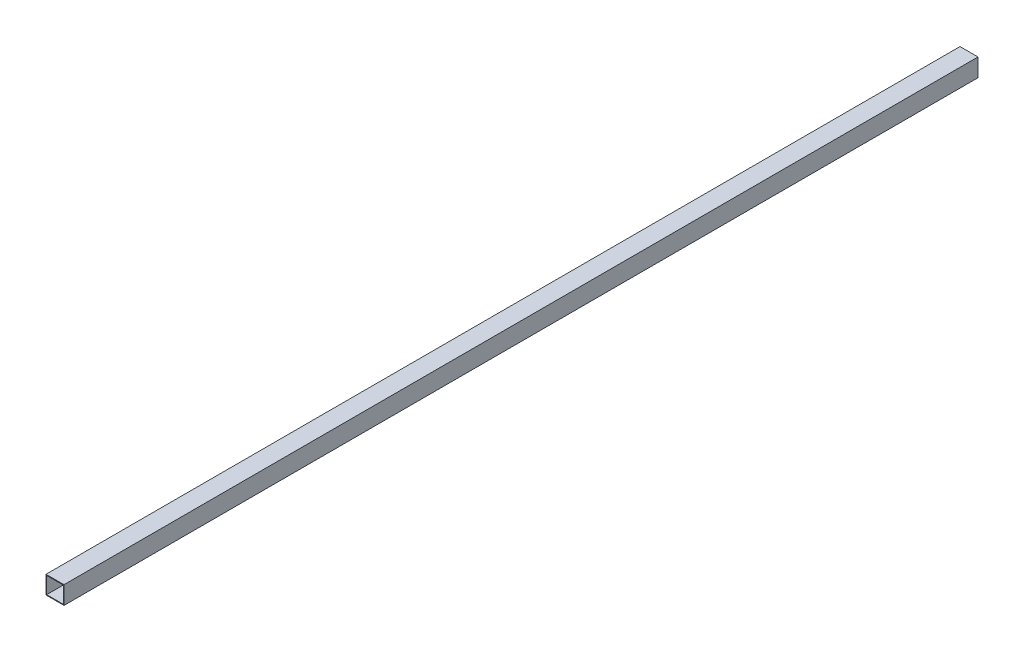
ISO-10303-21;
HEADER;
FILE_DESCRIPTION(('STEP AP214'),'2;1');
FILE_NAME('part.step','',(''),(''),'','','');
FILE_SCHEMA(('AUTOMOTIVE_DESIGN { 1 0 10303 214 1 1 1 1 }'));
ENDSEC;
DATA;
#1=APPLICATION_CONTEXT('core data for automotive mechanical design processes');
#2=APPLICATION_PROTOCOL_DEFINITION('international standard','automotive_design',2000,#1);
#3=PRODUCT_CONTEXT('',#1,'mechanical');
#4=PRODUCT('Part','Part','',(#3));
#5=PRODUCT_RELATED_PRODUCT_CATEGORY('part','',(#4));
#6=PRODUCT_DEFINITION_FORMATION('','',#4);
#7=PRODUCT_DEFINITION_CONTEXT('part definition',#1,'design');
#8=PRODUCT_DEFINITION('design','',#6,#7);
#9=PRODUCT_DEFINITION_SHAPE('','',#8);
#10=(LENGTH_UNIT() NAMED_UNIT(*) SI_UNIT(.MILLI.,.METRE.));
#11=(NAMED_UNIT(*) PLANE_ANGLE_UNIT() SI_UNIT($,.RADIAN.));
#12=(NAMED_UNIT(*) SI_UNIT($,.STERADIAN.) SOLID_ANGLE_UNIT());
#13=UNCERTAINTY_MEASURE_WITH_UNIT(LENGTH_MEASURE(1.E-05),#10,'distance_accuracy_value','');
#14=(GEOMETRIC_REPRESENTATION_CONTEXT(3) GLOBAL_UNCERTAINTY_ASSIGNED_CONTEXT((#13)) GLOBAL_UNIT_ASSIGNED_CONTEXT((#10,
#11,#12)) REPRESENTATION_CONTEXT('',''));
#15=CARTESIAN_POINT('',(0.,0.,0.));
#16=DIRECTION('',(0.,0.,1.));
#17=DIRECTION('',(1.,0.,0.));
#18=AXIS2_PLACEMENT_3D('',#15,#16,#17);
#19=CARTESIAN_POINT('',(6.5,6.5,-80.));
#20=DIRECTION('',(1.,0.,0.));
#21=DIRECTION('',(0.,0.,-1.));
#22=AXIS2_PLACEMENT_3D('',#19,#20,#21);
#23=PLANE('',#22);
#24=DIRECTION('',(0.,0.,1.));
#25=VECTOR('',#24,1.);
#26=CARTESIAN_POINT('',(6.5,6.5,-80.));
#27=LINE('',#26,#25);
#28=CARTESIAN_POINT('',(6.5,6.5,-80.));
#29=VERTEX_POINT('',#28);
#30=CARTESIAN_POINT('',(6.5,6.5,580.));
#31=VERTEX_POINT('',#30);
#32=EDGE_CURVE('E36',#29,#31,#27,.T.);
#33=ORIENTED_EDGE('',*,*,#32,.T.);
#34=DIRECTION('',(0.,1.,0.));
#35=VECTOR('',#34,1.);
#36=CARTESIAN_POINT('',(6.5,6.5,580.));
#37=LINE('',#36,#35);
#38=CARTESIAN_POINT('',(6.5,-6.5,580.));
#39=VERTEX_POINT('',#38);
#40=EDGE_CURVE('E128',#39,#31,#37,.T.);
#41=ORIENTED_EDGE('',*,*,#40,.F.);
#42=DIRECTION('',(0.,0.,1.));
#43=VECTOR('',#42,1.);
#44=CARTESIAN_POINT('',(6.5,-6.5,-80.));
#45=LINE('',#44,#43);
#46=CARTESIAN_POINT('',(6.5,-6.5,-80.));
#47=VERTEX_POINT('',#46);
#48=EDGE_CURVE('E11',#47,#39,#45,.T.);
#49=ORIENTED_EDGE('',*,*,#48,.F.);
#50=DIRECTION('',(0.,1.,0.));
#51=VECTOR('',#50,1.);
#52=CARTESIAN_POINT('',(6.5,6.5,-80.));
#53=LINE('',#52,#51);
#54=EDGE_CURVE('E147',#47,#29,#53,.T.);
#55=ORIENTED_EDGE('',*,*,#54,.T.);
#56=EDGE_LOOP('',(#33,#41,#49,#55));
#57=FACE_BOUND('',#56,.T.);
#58=ADVANCED_FACE('F33',(#57),#23,.T.);
#59=CARTESIAN_POINT('',(-6.5,-6.5,-80.));
#60=DIRECTION('',(0.,-1.,0.));
#61=DIRECTION('',(0.,0.,-1.));
#62=AXIS2_PLACEMENT_3D('',#59,#60,#61);
#63=PLANE('',#62);
#64=ORIENTED_EDGE('',*,*,#48,.T.);
#65=DIRECTION('',(1.,0.,0.));
#66=VECTOR('',#65,1.);
#67=CARTESIAN_POINT('',(-6.5,-6.5,580.));
#68=LINE('',#67,#66);
#69=CARTESIAN_POINT('',(-6.5,-6.5,580.));
#70=VERTEX_POINT('',#69);
#71=EDGE_CURVE('E137',#70,#39,#68,.T.);
#72=ORIENTED_EDGE('',*,*,#71,.F.);
#73=DIRECTION('',(0.,0.,1.));
#74=VECTOR('',#73,1.);
#75=CARTESIAN_POINT('',(-6.5,-6.5,-80.));
#76=LINE('',#75,#74);
#77=CARTESIAN_POINT('',(-6.5,-6.5,-80.));
#78=VERTEX_POINT('',#77);
#79=EDGE_CURVE('E41',#78,#70,#76,.T.);
#80=ORIENTED_EDGE('',*,*,#79,.F.);
#81=DIRECTION('',(1.,0.,0.));
#82=VECTOR('',#81,1.);
#83=CARTESIAN_POINT('',(-6.5,-6.5,-80.));
#84=LINE('',#83,#82);
#85=EDGE_CURVE('E158',#78,#47,#84,.T.);
#86=ORIENTED_EDGE('',*,*,#85,.T.);
#87=EDGE_LOOP('',(#64,#72,#80,#86));
#88=FACE_BOUND('',#87,.T.);
#89=ADVANCED_FACE('F170',(#88),#63,.T.);
#90=CARTESIAN_POINT('',(-6.5,6.5,-80.));
#91=DIRECTION('',(-1.,0.,0.));
#92=DIRECTION('',(0.,-1.,0.));
#93=AXIS2_PLACEMENT_3D('',#90,#91,#92);
#94=PLANE('',#93);
#95=ORIENTED_EDGE('',*,*,#79,.T.);
#96=DIRECTION('',(0.,-1.,0.));
#97=VECTOR('',#96,1.);
#98=CARTESIAN_POINT('',(-6.5,6.5,580.));
#99=LINE('',#98,#97);
#100=CARTESIAN_POINT('',(-6.5,6.5,580.));
#101=VERTEX_POINT('',#100);
#102=EDGE_CURVE('E134',#101,#70,#99,.T.);
#103=ORIENTED_EDGE('',*,*,#102,.F.);
#104=DIRECTION('',(0.,0.,1.));
#105=VECTOR('',#104,1.);
#106=CARTESIAN_POINT('',(-6.5,6.5,-80.));
#107=LINE('',#106,#105);
#108=CARTESIAN_POINT('',(-6.5,6.5,-80.));
#109=VERTEX_POINT('',#108);
#110=EDGE_CURVE('E161',#109,#101,#107,.T.);
#111=ORIENTED_EDGE('',*,*,#110,.F.);
#112=DIRECTION('',(0.,-1.,0.));
#113=VECTOR('',#112,1.);
#114=CARTESIAN_POINT('',(-6.5,6.5,-80.));
#115=LINE('',#114,#113);
#116=EDGE_CURVE('E155',#109,#78,#115,.T.);
#117=ORIENTED_EDGE('',*,*,#116,.T.);
#118=EDGE_LOOP('',(#95,#103,#111,#117));
#119=FACE_BOUND('',#118,.T.);
#120=ADVANCED_FACE('F176',(#119),#94,.T.);
#121=CARTESIAN_POINT('',(-6.5,6.5,-80.));
#122=DIRECTION('',(0.,1.,0.));
#123=DIRECTION('',(0.,0.,1.));
#124=AXIS2_PLACEMENT_3D('',#121,#122,#123);
#125=PLANE('',#124);
#126=ORIENTED_EDGE('',*,*,#110,.T.);
#127=DIRECTION('',(-1.,0.,0.));
#128=VECTOR('',#127,1.);
#129=CARTESIAN_POINT('',(-6.5,6.5,580.));
#130=LINE('',#129,#128);
#131=EDGE_CURVE('E131',#31,#101,#130,.T.);
#132=ORIENTED_EDGE('',*,*,#131,.F.);
#133=ORIENTED_EDGE('',*,*,#32,.F.);
#134=DIRECTION('',(-1.,0.,0.));
#135=VECTOR('',#134,1.);
#136=CARTESIAN_POINT('',(-6.5,6.5,-80.));
#137=LINE('',#136,#135);
#138=EDGE_CURVE('E152',#29,#109,#137,.T.);
#139=ORIENTED_EDGE('',*,*,#138,.T.);
#140=EDGE_LOOP('',(#126,#132,#133,#139));
#141=FACE_BOUND('',#140,.T.);
#142=ADVANCED_FACE('F165',(#141),#125,.T.);
#143=CARTESIAN_POINT('',(0.,0.,-80.));
#144=DIRECTION('',(0.,0.,1.));
#145=DIRECTION('',(1.,0.,0.));
#146=AXIS2_PLACEMENT_3D('',#143,#144,#145);
#147=PLANE('',#146);
#148=DIRECTION('',(-1.,0.,0.));
#149=VECTOR('',#148,1.);
#150=CARTESIAN_POINT('',(6.,6.,-80.));
#151=LINE('',#150,#149);
#152=CARTESIAN_POINT('',(6.,6.,-80.));
#153=VERTEX_POINT('',#152);
#154=CARTESIAN_POINT('',(-6.,6.,-80.));
#155=VERTEX_POINT('',#154);
#156=EDGE_CURVE('E110',#153,#155,#151,.T.);
#157=ORIENTED_EDGE('',*,*,#156,.T.);
#158=DIRECTION('',(0.,-1.,0.));
#159=VECTOR('',#158,1.);
#160=CARTESIAN_POINT('',(-6.,6.,-80.));
#161=LINE('',#160,#159);
#162=CARTESIAN_POINT('',(-6.,-6.,-80.));
#163=VERTEX_POINT('',#162);
#164=EDGE_CURVE('E140',#155,#163,#161,.T.);
#165=ORIENTED_EDGE('',*,*,#164,.T.);
#166=DIRECTION('',(1.,0.,0.));
#167=VECTOR('',#166,1.);
#168=CARTESIAN_POINT('',(6.,-6.,-80.));
#169=LINE('',#168,#167);
#170=CARTESIAN_POINT('',(6.,-6.,-80.));
#171=VERTEX_POINT('',#170);
#172=EDGE_CURVE('E105',#163,#171,#169,.T.);
#173=ORIENTED_EDGE('',*,*,#172,.T.);
#174=DIRECTION('',(0.,1.,0.));
#175=VECTOR('',#174,1.);
#176=CARTESIAN_POINT('',(6.,6.,-80.));
#177=LINE('',#176,#175);
#178=EDGE_CURVE('E49',#171,#153,#177,.T.);
#179=ORIENTED_EDGE('',*,*,#178,.T.);
#180=EDGE_LOOP('',(#157,#165,#173,#179));
#181=FACE_BOUND('',#180,.T.);
#182=ORIENTED_EDGE('',*,*,#54,.F.);
#183=ORIENTED_EDGE('',*,*,#85,.F.);
#184=ORIENTED_EDGE('',*,*,#116,.F.);
#185=ORIENTED_EDGE('',*,*,#138,.F.);
#186=EDGE_LOOP('',(#182,#183,#184,#185));
#187=FACE_BOUND('',#186,.T.);
#188=ADVANCED_FACE('F174',(#181,#187),#147,.F.);
#189=CARTESIAN_POINT('',(-6.,6.,-80.));
#190=DIRECTION('',(-1.,0.,0.));
#191=DIRECTION('',(0.,-1.,0.));
#192=AXIS2_PLACEMENT_3D('',#189,#190,#191);
#193=PLANE('',#192);
#194=DIRECTION('',(0.,0.,1.));
#195=VECTOR('',#194,1.);
#196=CARTESIAN_POINT('',(-6.,6.,-80.));
#197=LINE('',#196,#195);
#198=CARTESIAN_POINT('',(-6.,6.,580.));
#199=VERTEX_POINT('',#198);
#200=EDGE_CURVE('E115',#155,#199,#197,.T.);
#201=ORIENTED_EDGE('',*,*,#200,.T.);
#202=DIRECTION('',(0.,-1.,0.));
#203=VECTOR('',#202,1.);
#204=CARTESIAN_POINT('',(-6.,6.,580.));
#205=LINE('',#204,#203);
#206=CARTESIAN_POINT('',(-6.,-6.,580.));
#207=VERTEX_POINT('',#206);
#208=EDGE_CURVE('E113',#199,#207,#205,.T.);
#209=ORIENTED_EDGE('',*,*,#208,.T.);
#210=DIRECTION('',(0.,0.,1.));
#211=VECTOR('',#210,1.);
#212=CARTESIAN_POINT('',(-6.,-6.,-80.));
#213=LINE('',#212,#211);
#214=EDGE_CURVE('E98',#163,#207,#213,.T.);
#215=ORIENTED_EDGE('',*,*,#214,.F.);
#216=ORIENTED_EDGE('',*,*,#164,.F.);
#217=EDGE_LOOP('',(#201,#209,#215,#216));
#218=FACE_BOUND('',#217,.T.);
#219=ADVANCED_FACE('F114',(#218),#193,.F.);
#220=CARTESIAN_POINT('',(6.,6.,-80.));
#221=DIRECTION('',(0.,1.,0.));
#222=DIRECTION('',(-1.,0.,0.));
#223=AXIS2_PLACEMENT_3D('',#220,#221,#222);
#224=PLANE('',#223);
#225=DIRECTION('',(0.,0.,1.));
#226=VECTOR('',#225,1.);
#227=CARTESIAN_POINT('',(6.,6.,-80.));
#228=LINE('',#227,#226);
#229=CARTESIAN_POINT('',(6.,6.,580.));
#230=VERTEX_POINT('',#229);
#231=EDGE_CURVE('E148',#153,#230,#228,.T.);
#232=ORIENTED_EDGE('',*,*,#231,.T.);
#233=DIRECTION('',(-1.,0.,0.));
#234=VECTOR('',#233,1.);
#235=CARTESIAN_POINT('',(6.,6.,580.));
#236=LINE('',#235,#234);
#237=EDGE_CURVE('E124',#230,#199,#236,.T.);
#238=ORIENTED_EDGE('',*,*,#237,.T.);
#239=ORIENTED_EDGE('',*,*,#200,.F.);
#240=ORIENTED_EDGE('',*,*,#156,.F.);
#241=EDGE_LOOP('',(#232,#238,#239,#240));
#242=FACE_BOUND('',#241,.T.);
#243=ADVANCED_FACE('F219',(#242),#224,.F.);
#244=CARTESIAN_POINT('',(6.,6.,-80.));
#245=DIRECTION('',(1.,0.,0.));
#246=DIRECTION('',(0.,1.,0.));
#247=AXIS2_PLACEMENT_3D('',#244,#245,#246);
#248=PLANE('',#247);
#249=DIRECTION('',(0.,0.,1.));
#250=VECTOR('',#249,1.);
#251=CARTESIAN_POINT('',(6.,-6.,-80.));
#252=LINE('',#251,#250);
#253=CARTESIAN_POINT('',(6.,-6.,580.));
#254=VERTEX_POINT('',#253);
#255=EDGE_CURVE('E109',#171,#254,#252,.T.);
#256=ORIENTED_EDGE('',*,*,#255,.T.);
#257=DIRECTION('',(0.,1.,0.));
#258=VECTOR('',#257,1.);
#259=CARTESIAN_POINT('',(6.,6.,580.));
#260=LINE('',#259,#258);
#261=EDGE_CURVE('E122',#254,#230,#260,.T.);
#262=ORIENTED_EDGE('',*,*,#261,.T.);
#263=ORIENTED_EDGE('',*,*,#231,.F.);
#264=ORIENTED_EDGE('',*,*,#178,.F.);
#265=EDGE_LOOP('',(#256,#262,#263,#264));
#266=FACE_BOUND('',#265,.T.);
#267=ADVANCED_FACE('F228',(#266),#248,.F.);
#268=CARTESIAN_POINT('',(6.,-6.,-80.));
#269=DIRECTION('',(0.,-1.,0.));
#270=DIRECTION('',(1.,0.,0.));
#271=AXIS2_PLACEMENT_3D('',#268,#269,#270);
#272=PLANE('',#271);
#273=ORIENTED_EDGE('',*,*,#214,.T.);
#274=DIRECTION('',(1.,0.,0.));
#275=VECTOR('',#274,1.);
#276=CARTESIAN_POINT('',(6.,-6.,580.));
#277=LINE('',#276,#275);
#278=EDGE_CURVE('E102',#207,#254,#277,.T.);
#279=ORIENTED_EDGE('',*,*,#278,.T.);
#280=ORIENTED_EDGE('',*,*,#255,.F.);
#281=ORIENTED_EDGE('',*,*,#172,.F.);
#282=EDGE_LOOP('',(#273,#279,#280,#281));
#283=FACE_BOUND('',#282,.T.);
#284=ADVANCED_FACE('F100',(#283),#272,.F.);
#285=CARTESIAN_POINT('',(0.,0.,580.));
#286=DIRECTION('',(0.,0.,1.));
#287=DIRECTION('',(1.,0.,0.));
#288=AXIS2_PLACEMENT_3D('',#285,#286,#287);
#289=PLANE('',#288);
#290=ORIENTED_EDGE('',*,*,#40,.T.);
#291=ORIENTED_EDGE('',*,*,#131,.T.);
#292=ORIENTED_EDGE('',*,*,#102,.T.);
#293=ORIENTED_EDGE('',*,*,#71,.T.);
#294=EDGE_LOOP('',(#290,#291,#292,#293));
#295=FACE_BOUND('',#294,.T.);
#296=ORIENTED_EDGE('',*,*,#278,.F.);
#297=ORIENTED_EDGE('',*,*,#208,.F.);
#298=ORIENTED_EDGE('',*,*,#237,.F.);
#299=ORIENTED_EDGE('',*,*,#261,.F.);
#300=EDGE_LOOP('',(#296,#297,#298,#299));
#301=FACE_BOUND('',#300,.T.);
#302=ADVANCED_FACE('F120',(#295,#301),#289,.T.);
#303=CLOSED_SHELL('',(#58,#89,#120,#142,#188,#219,#243,#267,#284,#302));
#304=MANIFOLD_SOLID_BREP('B2',#303);
#305=ADVANCED_BREP_SHAPE_REPRESENTATION('',(#18,#304),#14);
#306=SHAPE_DEFINITION_REPRESENTATION(#9,#305);
ENDSEC;
END-ISO-10303-21;
